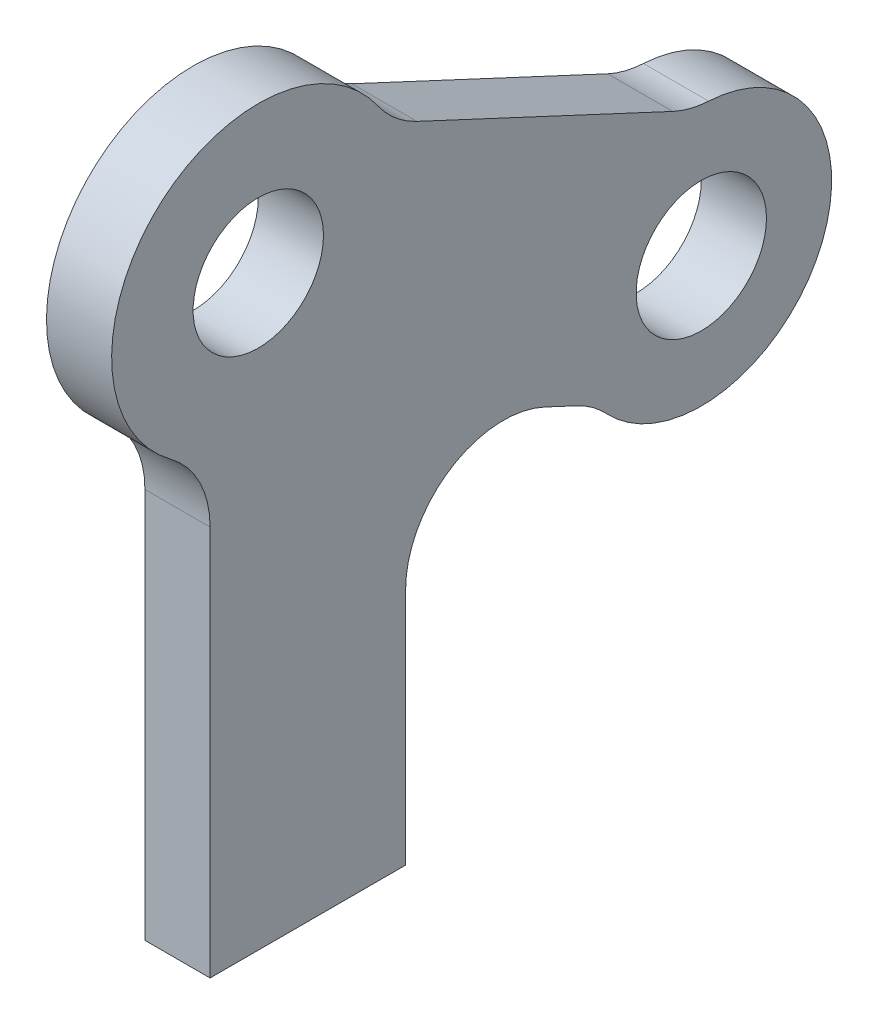
ISO-10303-21;
HEADER;
FILE_DESCRIPTION(('STEP AP214'),'2;1');
FILE_NAME('part.step','',(''),(''),'','','');
FILE_SCHEMA(('AUTOMOTIVE_DESIGN { 1 0 10303 214 1 1 1 1 }'));
ENDSEC;
DATA;
#1=APPLICATION_CONTEXT('core data for automotive mechanical design processes');
#2=APPLICATION_PROTOCOL_DEFINITION('international standard','automotive_design',2000,#1);
#3=PRODUCT_CONTEXT('',#1,'mechanical');
#4=PRODUCT('Part','Part','',(#3));
#5=PRODUCT_RELATED_PRODUCT_CATEGORY('part','',(#4));
#6=PRODUCT_DEFINITION_FORMATION('','',#4);
#7=PRODUCT_DEFINITION_CONTEXT('part definition',#1,'design');
#8=PRODUCT_DEFINITION('design','',#6,#7);
#9=PRODUCT_DEFINITION_SHAPE('','',#8);
#10=(LENGTH_UNIT() NAMED_UNIT(*) SI_UNIT(.MILLI.,.METRE.));
#11=(NAMED_UNIT(*) PLANE_ANGLE_UNIT() SI_UNIT($,.RADIAN.));
#12=(NAMED_UNIT(*) SI_UNIT($,.STERADIAN.) SOLID_ANGLE_UNIT());
#13=UNCERTAINTY_MEASURE_WITH_UNIT(LENGTH_MEASURE(1.E-05),#10,'distance_accuracy_value','');
#14=(GEOMETRIC_REPRESENTATION_CONTEXT(3) GLOBAL_UNCERTAINTY_ASSIGNED_CONTEXT((#13)) GLOBAL_UNIT_ASSIGNED_CONTEXT((#10,
#11,#12)) REPRESENTATION_CONTEXT('',''));
#15=CARTESIAN_POINT('',(0.,0.,0.));
#16=DIRECTION('',(0.,0.,1.));
#17=DIRECTION('',(1.,0.,0.));
#18=AXIS2_PLACEMENT_3D('',#15,#16,#17);
#19=CARTESIAN_POINT('',(0.,0.,0.));
#20=DIRECTION('',(1.,0.,0.));
#21=DIRECTION('',(0.,0.,-1.));
#22=AXIS2_PLACEMENT_3D('',#19,#20,#21);
#23=PLANE('',#22);
#24=CARTESIAN_POINT('',(0.,0.,0.));
#25=DIRECTION('',(1.,0.,0.));
#26=DIRECTION('',(0.,0.,-1.));
#27=AXIS2_PLACEMENT_3D('',#24,#25,#26);
#28=CIRCLE('',#27,2.);
#29=CARTESIAN_POINT('',(0.,0.,-2.));
#30=VERTEX_POINT('',#29);
#31=EDGE_CURVE('E381',#30,#30,#28,.T.);
#32=ORIENTED_EDGE('',*,*,#31,.T.);
#33=EDGE_LOOP('',(#32));
#34=FACE_BOUND('',#33,.T.);
#35=CARTESIAN_POINT('',(0.,-6.33927392611045,-13.5946168055498));
#36=DIRECTION('',(1.,0.,0.));
#37=DIRECTION('',(0.,0.,-1.));
#38=AXIS2_PLACEMENT_3D('',#35,#36,#37);
#39=CIRCLE('',#38,2.);
#40=CARTESIAN_POINT('',(0.,-6.33927392611045,-15.5946168055498));
#41=VERTEX_POINT('',#40);
#42=EDGE_CURVE('E402',#41,#41,#39,.T.);
#43=ORIENTED_EDGE('',*,*,#42,.T.);
#44=EDGE_LOOP('',(#43));
#45=FACE_BOUND('',#44,.T.);
#46=DIRECTION('',(0.,-1.,0.));
#47=VECTOR('',#46,1.);
#48=CARTESIAN_POINT('',(0.,-3.17207725462828,1.47916391609244));
#49=LINE('',#48,#47);
#50=CARTESIAN_POINT('',(0.,-6.01557068055687,1.47916391609244));
#51=VERTEX_POINT('',#50);
#52=CARTESIAN_POINT('',(0.,-18.,1.47916391609244));
#53=VERTEX_POINT('',#52);
#54=EDGE_CURVE('E219',#51,#53,#49,.T.);
#55=ORIENTED_EDGE('',*,*,#54,.F.);
#56=CARTESIAN_POINT('',(0.,-6.01557068055687,4.47916391609244));
#57=DIRECTION('',(1.,0.,0.));
#58=DIRECTION('',(0.,0.,-1.));
#59=AXIS2_PLACEMENT_3D('',#56,#57,#58);
#60=CIRCLE('',#59,3.);
#61=CARTESIAN_POINT('',(0.,-3.60934240833412,2.68749834965546));
#62=VERTEX_POINT('',#61);
#63=EDGE_CURVE('E117',#51,#62,#60,.T.);
#64=ORIENTED_EDGE('',*,*,#63,.T.);
#65=CARTESIAN_POINT('',(0.,0.,0.));
#66=DIRECTION('',(1.,0.,0.));
#67=DIRECTION('',(0.,0.,-1.));
#68=AXIS2_PLACEMENT_3D('',#65,#66,#67);
#69=CIRCLE('',#68,4.5);
#70=CARTESIAN_POINT('',(0.,2.58582472494635,-3.68286715642258));
#71=VERTEX_POINT('',#70);
#72=EDGE_CURVE('E294',#71,#62,#69,.T.);
#73=ORIENTED_EDGE('',*,*,#72,.F.);
#74=CARTESIAN_POINT('',(0.,4.30970787491059,-6.13811192737096));
#75=DIRECTION('',(1.,0.,0.));
#76=DIRECTION('',(0.,0.,-1.));
#77=AXIS2_PLACEMENT_3D('',#74,#75,#76);
#78=CIRCLE('',#77,3.);
#79=CARTESIAN_POINT('',(0.,1.59078451380063,-4.87025714214887));
#80=VERTEX_POINT('',#79);
#81=EDGE_CURVE('E282',#71,#80,#78,.T.);
#82=ORIENTED_EDGE('',*,*,#81,.T.);
#83=DIRECTION('',(0.,-0.422618261740697,-0.906307787036651));
#84=VECTOR('',#83,1.);
#85=CARTESIAN_POINT('',(0.,3.17207725462828,-1.47916391609244));
#86=LINE('',#85,#84);
#87=CARTESIAN_POINT('',(0.,-2.06920221917018,-12.719124019978));
#88=VERTEX_POINT('',#87);
#89=EDGE_CURVE('E357',#80,#88,#86,.T.);
#90=ORIENTED_EDGE('',*,*,#89,.T.);
#91=CARTESIAN_POINT('',(0.,0.649721141939774,-13.9869788052001));
#92=DIRECTION('',(1.,0.,0.));
#93=DIRECTION('',(0.,0.,-1.));
#94=AXIS2_PLACEMENT_3D('',#91,#92,#93);
#95=CIRCLE('',#94,3.);
#96=CARTESIAN_POINT('',(0.,-2.34556245865318,-13.8188236624928));
#97=VERTEX_POINT('',#96);
#98=EDGE_CURVE('E273',#88,#97,#95,.T.);
#99=ORIENTED_EDGE('',*,*,#98,.T.);
#100=CARTESIAN_POINT('',(0.,-6.33927392611045,-13.5946168055498));
#101=DIRECTION('',(1.,0.,0.));
#102=DIRECTION('',(0.,0.,-1.));
#103=AXIS2_PLACEMENT_3D('',#100,#101,#102);
#104=CIRCLE('',#103,4.);
#105=CARTESIAN_POINT('',(0.,-9.07813459092545,-10.6793737181334));
#106=VERTEX_POINT('',#105);
#107=EDGE_CURVE('E222',#106,#97,#104,.T.);
#108=ORIENTED_EDGE('',*,*,#107,.F.);
#109=CARTESIAN_POINT('',(0.,-11.1322800895367,-8.49294140257105));
#110=DIRECTION('',(1.,0.,0.));
#111=DIRECTION('',(0.,0.,-1.));
#112=AXIS2_PLACEMENT_3D('',#109,#110,#111);
#113=CIRCLE('',#112,3.);
#114=CARTESIAN_POINT('',(0.,-8.41335672842674,-9.76079618779314));
#115=VERTEX_POINT('',#114);
#116=EDGE_CURVE('E267',#106,#115,#113,.T.);
#117=ORIENTED_EDGE('',*,*,#116,.T.);
#118=DIRECTION('',(0.,-0.422618261740697,-0.906307787036651));
#119=VECTOR('',#118,1.);
#120=CARTESIAN_POINT('',(0.,-3.17207725462828,1.47916391609244));
#121=LINE('',#120,#119);
#122=CARTESIAN_POINT('',(0.,-7.96005657380075,-8.78869086912966));
#123=VERTEX_POINT('',#122);
#124=EDGE_CURVE('E362',#123,#115,#121,.T.);
#125=ORIENTED_EDGE('',*,*,#124,.F.);
#126=CARTESIAN_POINT('',(0.,-10.6789799349107,-7.52083608390756));
#127=DIRECTION('',(1.,0.,0.));
#128=DIRECTION('',(0.,0.,-1.));
#129=AXIS2_PLACEMENT_3D('',#126,#127,#128);
#130=CIRCLE('',#129,3.);
#131=CARTESIAN_POINT('',(0.,-10.6789799349107,-4.52083608390756));
#132=VERTEX_POINT('',#131);
#133=EDGE_CURVE('E285',#123,#132,#130,.T.);
#134=ORIENTED_EDGE('',*,*,#133,.T.);
#135=DIRECTION('',(0.,-1.,0.));
#136=VECTOR('',#135,1.);
#137=CARTESIAN_POINT('',(0.,-3.17207725462828,-4.52083608390756));
#138=LINE('',#137,#136);
#139=CARTESIAN_POINT('',(0.,-18.,-4.52083608390756));
#140=VERTEX_POINT('',#139);
#141=EDGE_CURVE('E205',#132,#140,#138,.T.);
#142=ORIENTED_EDGE('',*,*,#141,.T.);
#143=DIRECTION('',(0.,0.,-1.));
#144=VECTOR('',#143,1.);
#145=CARTESIAN_POINT('',(0.,-18.,1.47916391609244));
#146=LINE('',#145,#144);
#147=EDGE_CURVE('E380',#53,#140,#146,.T.);
#148=ORIENTED_EDGE('',*,*,#147,.F.);
#149=EDGE_LOOP('',(#55,#64,#73,#82,#90,#99,#108,#117,#125,#134,#142,#148));
#150=FACE_BOUND('',#149,.T.);
#151=ADVANCED_FACE('F108',(#34,#45,#150),#23,.F.);
#152=CARTESIAN_POINT('',(2.,0.,0.));
#153=DIRECTION('',(1.,0.,0.));
#154=DIRECTION('',(0.,0.,-1.));
#155=AXIS2_PLACEMENT_3D('',#152,#153,#154);
#156=PLANE('',#155);
#157=CARTESIAN_POINT('',(2.,0.,0.));
#158=DIRECTION('',(1.,0.,0.));
#159=DIRECTION('',(0.,0.,-1.));
#160=AXIS2_PLACEMENT_3D('',#157,#158,#159);
#161=CIRCLE('',#160,2.);
#162=CARTESIAN_POINT('',(2.,0.,-2.));
#163=VERTEX_POINT('',#162);
#164=EDGE_CURVE('E406',#163,#163,#161,.T.);
#165=ORIENTED_EDGE('',*,*,#164,.F.);
#166=EDGE_LOOP('',(#165));
#167=FACE_BOUND('',#166,.T.);
#168=CARTESIAN_POINT('',(2.,-6.33927392611045,-13.5946168055498));
#169=DIRECTION('',(1.,0.,0.));
#170=DIRECTION('',(0.,0.,-1.));
#171=AXIS2_PLACEMENT_3D('',#168,#169,#170);
#172=CIRCLE('',#171,2.);
#173=CARTESIAN_POINT('',(2.,-6.33927392611045,-15.5946168055498));
#174=VERTEX_POINT('',#173);
#175=EDGE_CURVE('E407',#174,#174,#172,.T.);
#176=ORIENTED_EDGE('',*,*,#175,.F.);
#177=EDGE_LOOP('',(#176));
#178=FACE_BOUND('',#177,.T.);
#179=DIRECTION('',(0.,-0.422618261740697,-0.906307787036651));
#180=VECTOR('',#179,1.);
#181=CARTESIAN_POINT('',(2.,3.17207725462828,-1.47916391609244));
#182=LINE('',#181,#180);
#183=CARTESIAN_POINT('',(2.,1.59078451380063,-4.87025714214887));
#184=VERTEX_POINT('',#183);
#185=CARTESIAN_POINT('',(2.,-2.06920221917018,-12.719124019978));
#186=VERTEX_POINT('',#185);
#187=EDGE_CURVE('E236',#184,#186,#182,.T.);
#188=ORIENTED_EDGE('',*,*,#187,.F.);
#189=CARTESIAN_POINT('',(2.,4.30970787491059,-6.13811192737096));
#190=DIRECTION('',(1.,0.,0.));
#191=DIRECTION('',(0.,0.,-1.));
#192=AXIS2_PLACEMENT_3D('',#189,#190,#191);
#193=CIRCLE('',#192,3.);
#194=CARTESIAN_POINT('',(2.,2.58582472494635,-3.68286715642258));
#195=VERTEX_POINT('',#194);
#196=EDGE_CURVE('E279',#184,#195,#193,.F.);
#197=ORIENTED_EDGE('',*,*,#196,.T.);
#198=CARTESIAN_POINT('',(2.,0.,0.));
#199=DIRECTION('',(1.,0.,0.));
#200=DIRECTION('',(0.,0.,-1.));
#201=AXIS2_PLACEMENT_3D('',#198,#199,#200);
#202=CIRCLE('',#201,4.5);
#203=CARTESIAN_POINT('',(2.,-3.60934240833412,2.68749834965546));
#204=VERTEX_POINT('',#203);
#205=EDGE_CURVE('E301',#195,#204,#202,.T.);
#206=ORIENTED_EDGE('',*,*,#205,.T.);
#207=CARTESIAN_POINT('',(2.,-6.01557068055687,4.47916391609244));
#208=DIRECTION('',(1.,0.,0.));
#209=DIRECTION('',(0.,0.,-1.));
#210=AXIS2_PLACEMENT_3D('',#207,#208,#209);
#211=CIRCLE('',#210,3.);
#212=CARTESIAN_POINT('',(2.,-6.01557068055687,1.47916391609244));
#213=VERTEX_POINT('',#212);
#214=EDGE_CURVE('E12',#204,#213,#211,.F.);
#215=ORIENTED_EDGE('',*,*,#214,.T.);
#216=DIRECTION('',(0.,-1.,0.));
#217=VECTOR('',#216,1.);
#218=CARTESIAN_POINT('',(2.,-3.17207725462828,1.47916391609244));
#219=LINE('',#218,#217);
#220=CARTESIAN_POINT('',(2.,-18.,1.47916391609244));
#221=VERTEX_POINT('',#220);
#222=EDGE_CURVE('E195',#213,#221,#219,.T.);
#223=ORIENTED_EDGE('',*,*,#222,.T.);
#224=DIRECTION('',(0.,0.,-1.));
#225=VECTOR('',#224,1.);
#226=CARTESIAN_POINT('',(2.,-18.,1.47916391609244));
#227=LINE('',#226,#225);
#228=CARTESIAN_POINT('',(2.,-18.,-4.52083608390756));
#229=VERTEX_POINT('',#228);
#230=EDGE_CURVE('E200',#221,#229,#227,.T.);
#231=ORIENTED_EDGE('',*,*,#230,.T.);
#232=DIRECTION('',(0.,-1.,0.));
#233=VECTOR('',#232,1.);
#234=CARTESIAN_POINT('',(2.,-3.17207725462828,-4.52083608390756));
#235=LINE('',#234,#233);
#236=CARTESIAN_POINT('',(2.,-10.6789799349107,-4.52083608390756));
#237=VERTEX_POINT('',#236);
#238=EDGE_CURVE('E215',#237,#229,#235,.T.);
#239=ORIENTED_EDGE('',*,*,#238,.F.);
#240=CARTESIAN_POINT('',(2.,-10.6789799349107,-7.52083608390756));
#241=DIRECTION('',(1.,0.,0.));
#242=DIRECTION('',(0.,0.,-1.));
#243=AXIS2_PLACEMENT_3D('',#240,#241,#242);
#244=CIRCLE('',#243,3.);
#245=CARTESIAN_POINT('',(2.,-7.96005657380075,-8.78869086912966));
#246=VERTEX_POINT('',#245);
#247=EDGE_CURVE('E288',#237,#246,#244,.F.);
#248=ORIENTED_EDGE('',*,*,#247,.T.);
#249=DIRECTION('',(0.,-0.422618261740697,-0.906307787036651));
#250=VECTOR('',#249,1.);
#251=CARTESIAN_POINT('',(2.,-3.17207725462828,1.47916391609244));
#252=LINE('',#251,#250);
#253=CARTESIAN_POINT('',(2.,-8.41335672842674,-9.76079618779314));
#254=VERTEX_POINT('',#253);
#255=EDGE_CURVE('E361',#246,#254,#252,.T.);
#256=ORIENTED_EDGE('',*,*,#255,.T.);
#257=CARTESIAN_POINT('',(2.,-11.1322800895367,-8.49294140257105));
#258=DIRECTION('',(1.,0.,0.));
#259=DIRECTION('',(0.,0.,-1.));
#260=AXIS2_PLACEMENT_3D('',#257,#258,#259);
#261=CIRCLE('',#260,3.);
#262=CARTESIAN_POINT('',(2.,-9.07813459092545,-10.6793737181334));
#263=VERTEX_POINT('',#262);
#264=EDGE_CURVE('E270',#254,#263,#261,.F.);
#265=ORIENTED_EDGE('',*,*,#264,.T.);
#266=CARTESIAN_POINT('',(2.,-6.33927392611045,-13.5946168055498));
#267=DIRECTION('',(1.,0.,0.));
#268=DIRECTION('',(0.,0.,-1.));
#269=AXIS2_PLACEMENT_3D('',#266,#267,#268);
#270=CIRCLE('',#269,4.);
#271=CARTESIAN_POINT('',(2.,-2.34556245865318,-13.8188236624928));
#272=VERTEX_POINT('',#271);
#273=EDGE_CURVE('E227',#263,#272,#270,.T.);
#274=ORIENTED_EDGE('',*,*,#273,.T.);
#275=CARTESIAN_POINT('',(2.,0.649721141939774,-13.9869788052001));
#276=DIRECTION('',(1.,0.,0.));
#277=DIRECTION('',(0.,0.,-1.));
#278=AXIS2_PLACEMENT_3D('',#275,#276,#277);
#279=CIRCLE('',#278,3.);
#280=EDGE_CURVE('E276',#272,#186,#279,.F.);
#281=ORIENTED_EDGE('',*,*,#280,.T.);
#282=EDGE_LOOP('',(#188,#197,#206,#215,#223,#231,#239,#248,#256,#265,#274,#281));
#283=FACE_BOUND('',#282,.T.);
#284=ADVANCED_FACE('F198',(#167,#178,#283),#156,.T.);
#285=CARTESIAN_POINT('',(2.,-3.17207725462828,1.47916391609244));
#286=DIRECTION('',(0.,0.906307787036651,-0.422618261740697));
#287=DIRECTION('',(0.,0.422618261740697,0.906307787036651));
#288=AXIS2_PLACEMENT_3D('',#285,#286,#287);
#289=PLANE('',#288);
#290=ORIENTED_EDGE('',*,*,#124,.T.);
#291=DIRECTION('',(1.,0.,0.));
#292=VECTOR('',#291,1.);
#293=CARTESIAN_POINT('',(2.,-8.41335672842674,-9.76079618779314));
#294=LINE('',#293,#292);
#295=EDGE_CURVE('E244',#115,#254,#294,.T.);
#296=ORIENTED_EDGE('',*,*,#295,.T.);
#297=ORIENTED_EDGE('',*,*,#255,.F.);
#298=DIRECTION('',(-1.,0.,0.));
#299=VECTOR('',#298,1.);
#300=CARTESIAN_POINT('',(2.,-7.96005657380075,-8.78869086912965));
#301=LINE('',#300,#299);
#302=EDGE_CURVE('E240',#246,#123,#301,.T.);
#303=ORIENTED_EDGE('',*,*,#302,.T.);
#304=EDGE_LOOP('',(#290,#296,#297,#303));
#305=FACE_BOUND('',#304,.T.);
#306=ADVANCED_FACE('F310',(#305),#289,.F.);
#307=CARTESIAN_POINT('',(2.,3.17207725462828,-1.47916391609244));
#308=DIRECTION('',(0.,0.906307787036651,-0.422618261740697));
#309=DIRECTION('',(0.,0.422618261740697,0.906307787036651));
#310=AXIS2_PLACEMENT_3D('',#307,#308,#309);
#311=PLANE('',#310);
#312=ORIENTED_EDGE('',*,*,#187,.T.);
#313=DIRECTION('',(-1.,0.,0.));
#314=VECTOR('',#313,1.);
#315=CARTESIAN_POINT('',(2.,-2.06920221917018,-12.719124019978));
#316=LINE('',#315,#314);
#317=EDGE_CURVE('E251',#186,#88,#316,.T.);
#318=ORIENTED_EDGE('',*,*,#317,.T.);
#319=ORIENTED_EDGE('',*,*,#89,.F.);
#320=DIRECTION('',(-1.,0.,0.));
#321=VECTOR('',#320,1.);
#322=CARTESIAN_POINT('',(2.,1.59078451380063,-4.87025714214887));
#323=LINE('',#322,#321);
#324=EDGE_CURVE('E247',#80,#184,#323,.F.);
#325=ORIENTED_EDGE('',*,*,#324,.T.);
#326=EDGE_LOOP('',(#312,#318,#319,#325));
#327=FACE_BOUND('',#326,.T.);
#328=ADVANCED_FACE('F312',(#327),#311,.T.);
#329=CARTESIAN_POINT('',(2.,0.,0.));
#330=DIRECTION('',(-1.,0.,0.));
#331=DIRECTION('',(0.,0.,1.));
#332=AXIS2_PLACEMENT_3D('',#329,#330,#331);
#333=CYLINDRICAL_SURFACE('',#332,4.5);
#334=ORIENTED_EDGE('',*,*,#205,.F.);
#335=DIRECTION('',(-1.,0.,0.));
#336=VECTOR('',#335,1.);
#337=CARTESIAN_POINT('',(2.,2.58582472494635,-3.68286715642258));
#338=LINE('',#337,#336);
#339=EDGE_CURVE('E258',#195,#71,#338,.T.);
#340=ORIENTED_EDGE('',*,*,#339,.T.);
#341=ORIENTED_EDGE('',*,*,#72,.T.);
#342=DIRECTION('',(-1.,0.,0.));
#343=VECTOR('',#342,1.);
#344=CARTESIAN_POINT('',(2.,-3.60934240833412,2.68749834965546));
#345=LINE('',#344,#343);
#346=EDGE_CURVE('E255',#62,#204,#345,.F.);
#347=ORIENTED_EDGE('',*,*,#346,.T.);
#348=EDGE_LOOP('',(#334,#340,#341,#347));
#349=FACE_BOUND('',#348,.T.);
#350=ADVANCED_FACE('F298',(#349),#333,.T.);
#351=CARTESIAN_POINT('',(2.,-3.17207725462828,1.47916391609244));
#352=DIRECTION('',(0.,0.,-1.));
#353=DIRECTION('',(0.,1.,0.));
#354=AXIS2_PLACEMENT_3D('',#351,#352,#353);
#355=PLANE('',#354);
#356=ORIENTED_EDGE('',*,*,#222,.F.);
#357=DIRECTION('',(1.,0.,0.));
#358=VECTOR('',#357,1.);
#359=CARTESIAN_POINT('',(0.,-6.01557068055687,1.47916391609244));
#360=LINE('',#359,#358);
#361=EDGE_CURVE('E264',#213,#51,#360,.F.);
#362=ORIENTED_EDGE('',*,*,#361,.T.);
#363=ORIENTED_EDGE('',*,*,#54,.T.);
#364=DIRECTION('',(-1.,0.,0.));
#365=VECTOR('',#364,1.);
#366=CARTESIAN_POINT('',(2.,-18.,1.47916391609244));
#367=LINE('',#366,#365);
#368=EDGE_CURVE('E211',#221,#53,#367,.T.);
#369=ORIENTED_EDGE('',*,*,#368,.F.);
#370=EDGE_LOOP('',(#356,#362,#363,#369));
#371=FACE_BOUND('',#370,.T.);
#372=ADVANCED_FACE('F217',(#371),#355,.F.);
#373=CARTESIAN_POINT('',(2.,-18.,1.47916391609244));
#374=DIRECTION('',(0.,1.,0.));
#375=DIRECTION('',(0.,0.,1.));
#376=AXIS2_PLACEMENT_3D('',#373,#374,#375);
#377=PLANE('',#376);
#378=ORIENTED_EDGE('',*,*,#147,.T.);
#379=DIRECTION('',(-1.,0.,0.));
#380=VECTOR('',#379,1.);
#381=CARTESIAN_POINT('',(2.,-18.,-4.52083608390756));
#382=LINE('',#381,#380);
#383=EDGE_CURVE('E213',#229,#140,#382,.T.);
#384=ORIENTED_EDGE('',*,*,#383,.F.);
#385=ORIENTED_EDGE('',*,*,#230,.F.);
#386=ORIENTED_EDGE('',*,*,#368,.T.);
#387=EDGE_LOOP('',(#378,#384,#385,#386));
#388=FACE_BOUND('',#387,.T.);
#389=ADVANCED_FACE('F210',(#388),#377,.F.);
#390=CARTESIAN_POINT('',(2.,-3.17207725462828,-4.52083608390756));
#391=DIRECTION('',(0.,0.,-1.));
#392=DIRECTION('',(0.,1.,0.));
#393=AXIS2_PLACEMENT_3D('',#390,#391,#392);
#394=PLANE('',#393);
#395=ORIENTED_EDGE('',*,*,#141,.F.);
#396=DIRECTION('',(-1.,0.,0.));
#397=VECTOR('',#396,1.);
#398=CARTESIAN_POINT('',(2.,-10.6789799349107,-4.52083608390756));
#399=LINE('',#398,#397);
#400=EDGE_CURVE('E261',#132,#237,#399,.F.);
#401=ORIENTED_EDGE('',*,*,#400,.T.);
#402=ORIENTED_EDGE('',*,*,#238,.T.);
#403=ORIENTED_EDGE('',*,*,#383,.T.);
#404=EDGE_LOOP('',(#395,#401,#402,#403));
#405=FACE_BOUND('',#404,.T.);
#406=ADVANCED_FACE('F325',(#405),#394,.T.);
#407=CARTESIAN_POINT('',(2.,-6.33927392611045,-13.5946168055498));
#408=DIRECTION('',(-1.,0.,0.));
#409=DIRECTION('',(0.,0.,1.));
#410=AXIS2_PLACEMENT_3D('',#407,#408,#409);
#411=CYLINDRICAL_SURFACE('',#410,4.);
#412=ORIENTED_EDGE('',*,*,#273,.F.);
#413=DIRECTION('',(-1.,0.,0.));
#414=VECTOR('',#413,1.);
#415=CARTESIAN_POINT('',(2.,-9.07813459092545,-10.6793737181334));
#416=LINE('',#415,#414);
#417=EDGE_CURVE('E235',#263,#106,#416,.T.);
#418=ORIENTED_EDGE('',*,*,#417,.T.);
#419=ORIENTED_EDGE('',*,*,#107,.T.);
#420=DIRECTION('',(-1.,0.,0.));
#421=VECTOR('',#420,1.);
#422=CARTESIAN_POINT('',(2.,-2.34556245865318,-13.8188236624928));
#423=LINE('',#422,#421);
#424=EDGE_CURVE('E232',#97,#272,#423,.F.);
#425=ORIENTED_EDGE('',*,*,#424,.T.);
#426=EDGE_LOOP('',(#412,#418,#419,#425));
#427=FACE_BOUND('',#426,.T.);
#428=ADVANCED_FACE('F321',(#427),#411,.T.);
#429=CARTESIAN_POINT('',(-1.2E-05,-6.33927392611045,-13.5946168055498));
#430=DIRECTION('',(1.,0.,0.));
#431=DIRECTION('',(0.,0.,-1.));
#432=AXIS2_PLACEMENT_3D('',#429,#430,#431);
#433=CYLINDRICAL_SURFACE('',#432,2.);
#434=CARTESIAN_POINT('',(2.,-6.33927392611045,-15.5946168055498));
#435=CARTESIAN_POINT('',(1.97916666666667,-6.33927392611045,-15.5946168055498));
#436=CARTESIAN_POINT('',(1.95833333333333,-6.33927392611045,-15.5946168055498));
#437=CARTESIAN_POINT('',(1.91666666666667,-6.33927392611045,-15.5946168055498));
#438=CARTESIAN_POINT('',(1.89583333333333,-6.33927392611045,-15.5946168055498));
#439=CARTESIAN_POINT('',(1.85416666666667,-6.33927392611045,-15.5946168055498));
#440=CARTESIAN_POINT('',(1.83333333333333,-6.33927392611045,-15.5946168055498));
#441=CARTESIAN_POINT('',(1.79166666666667,-6.33927392611045,-15.5946168055498));
#442=CARTESIAN_POINT('',(1.77083333333333,-6.33927392611045,-15.5946168055498));
#443=CARTESIAN_POINT('',(1.72916666666667,-6.33927392611045,-15.5946168055498));
#444=CARTESIAN_POINT('',(1.70833333333333,-6.33927392611045,-15.5946168055498));
#445=CARTESIAN_POINT('',(1.66666666666667,-6.33927392611045,-15.5946168055498));
#446=CARTESIAN_POINT('',(1.64583333333333,-6.33927392611045,-15.5946168055498));
#447=CARTESIAN_POINT('',(1.60416666666667,-6.33927392611045,-15.5946168055498));
#448=CARTESIAN_POINT('',(1.58333333333333,-6.33927392611045,-15.5946168055498));
#449=CARTESIAN_POINT('',(1.54166666666667,-6.33927392611045,-15.5946168055498));
#450=CARTESIAN_POINT('',(1.52083333333333,-6.33927392611045,-15.5946168055498));
#451=CARTESIAN_POINT('',(1.47916666666667,-6.33927392611045,-15.5946168055498));
#452=CARTESIAN_POINT('',(1.45833333333333,-6.33927392611045,-15.5946168055498));
#453=CARTESIAN_POINT('',(1.41666666666667,-6.33927392611045,-15.5946168055498));
#454=CARTESIAN_POINT('',(1.39583333333333,-6.33927392611045,-15.5946168055498));
#455=CARTESIAN_POINT('',(1.35416666666667,-6.33927392611045,-15.5946168055498));
#456=CARTESIAN_POINT('',(1.33333333333333,-6.33927392611045,-15.5946168055498));
#457=CARTESIAN_POINT('',(1.29166666666667,-6.33927392611045,-15.5946168055498));
#458=CARTESIAN_POINT('',(1.27083333333333,-6.33927392611045,-15.5946168055498));
#459=CARTESIAN_POINT('',(1.22916666666667,-6.33927392611045,-15.5946168055498));
#460=CARTESIAN_POINT('',(1.20833333333333,-6.33927392611045,-15.5946168055498));
#461=CARTESIAN_POINT('',(1.16666666666667,-6.33927392611045,-15.5946168055498));
#462=CARTESIAN_POINT('',(1.14583333333333,-6.33927392611045,-15.5946168055498));
#463=CARTESIAN_POINT('',(1.10416666666667,-6.33927392611045,-15.5946168055498));
#464=CARTESIAN_POINT('',(1.08333333333333,-6.33927392611045,-15.5946168055498));
#465=CARTESIAN_POINT('',(1.04166666666667,-6.33927392611045,-15.5946168055498));
#466=CARTESIAN_POINT('',(1.02083333333333,-6.33927392611045,-15.5946168055498));
#467=CARTESIAN_POINT('',(0.979166666666667,-6.33927392611045,-15.5946168055498));
#468=CARTESIAN_POINT('',(0.958333333333334,-6.33927392611045,-15.5946168055498));
#469=CARTESIAN_POINT('',(0.916666666666667,-6.33927392611045,-15.5946168055498));
#470=CARTESIAN_POINT('',(0.895833333333334,-6.33927392611045,-15.5946168055498));
#471=CARTESIAN_POINT('',(0.854166666666667,-6.33927392611045,-15.5946168055498));
#472=CARTESIAN_POINT('',(0.833333333333334,-6.33927392611045,-15.5946168055498));
#473=CARTESIAN_POINT('',(0.791666666666667,-6.33927392611045,-15.5946168055498));
#474=CARTESIAN_POINT('',(0.770833333333334,-6.33927392611045,-15.5946168055498));
#475=CARTESIAN_POINT('',(0.729166666666667,-6.33927392611045,-15.5946168055498));
#476=CARTESIAN_POINT('',(0.708333333333334,-6.33927392611045,-15.5946168055498));
#477=CARTESIAN_POINT('',(0.666666666666667,-6.33927392611045,-15.5946168055498));
#478=CARTESIAN_POINT('',(0.645833333333334,-6.33927392611045,-15.5946168055498));
#479=CARTESIAN_POINT('',(0.604166666666667,-6.33927392611045,-15.5946168055498));
#480=CARTESIAN_POINT('',(0.583333333333333,-6.33927392611045,-15.5946168055498));
#481=CARTESIAN_POINT('',(0.541666666666667,-6.33927392611045,-15.5946168055498));
#482=CARTESIAN_POINT('',(0.520833333333333,-6.33927392611045,-15.5946168055498));
#483=CARTESIAN_POINT('',(0.479166666666667,-6.33927392611045,-15.5946168055498));
#484=CARTESIAN_POINT('',(0.458333333333334,-6.33927392611045,-15.5946168055498));
#485=CARTESIAN_POINT('',(0.416666666666667,-6.33927392611045,-15.5946168055498));
#486=CARTESIAN_POINT('',(0.395833333333334,-6.33927392611045,-15.5946168055498));
#487=CARTESIAN_POINT('',(0.354166666666667,-6.33927392611045,-15.5946168055498));
#488=CARTESIAN_POINT('',(0.333333333333334,-6.33927392611045,-15.5946168055498));
#489=CARTESIAN_POINT('',(0.291666666666667,-6.33927392611045,-15.5946168055498));
#490=CARTESIAN_POINT('',(0.270833333333333,-6.33927392611045,-15.5946168055498));
#491=CARTESIAN_POINT('',(0.229166666666667,-6.33927392611045,-15.5946168055498));
#492=CARTESIAN_POINT('',(0.208333333333333,-6.33927392611045,-15.5946168055498));
#493=CARTESIAN_POINT('',(0.166666666666667,-6.33927392611045,-15.5946168055498));
#494=CARTESIAN_POINT('',(0.145833333333334,-6.33927392611045,-15.5946168055498));
#495=CARTESIAN_POINT('',(0.104166666666667,-6.33927392611045,-15.5946168055498));
#496=CARTESIAN_POINT('',(0.0833333333333336,-6.33927392611045,-15.5946168055498));
#497=CARTESIAN_POINT('',(0.0416666666666669,-6.33927392611045,-15.5946168055498));
#498=CARTESIAN_POINT('',(0.0208333333333335,-6.33927392611045,-15.5946168055498));
#499=CARTESIAN_POINT('',(0.,-6.33927392611045,-15.5946168055498));
#500=B_SPLINE_CURVE_WITH_KNOTS('',3,(#434,#435,#436,#437,#438,#439,#440,#441,#442,#443,#444,
#445,#446,#447,#448,#449,#450,#451,#452,#453,#454,#455,#456,#457,#458,#459,#460,#461,#462,#463,
#464,#465,#466,#467,#468,#469,#470,#471,#472,#473,#474,#475,#476,#477,#478,#479,#480,#481,#482,
#483,#484,#485,#486,#487,#488,#489,#490,#491,#492,#493,#494,#495,#496,#497,#498,#499),
.UNSPECIFIED.,.F.,.F.,(4,2,2,2,2,2,2,2,2,2,2,2,2,2,2,2,2,2,2,2,2,2,2,2,2,2,2,2,2,2,2,2,4),(0.,
0.0624999999999996,0.125,0.1875,0.25,0.3125,0.375,0.4375,0.5,0.5625,0.625,0.6875,0.75,0.8125,
0.875,0.9375,1.,1.0625,1.125,1.1875,1.25,1.3125,1.375,1.4375,1.5,1.5625,1.625,1.6875,1.75,
1.8125,1.875,1.9375,2.),.UNSPECIFIED.);
#501=EDGE_CURVE('BSEAM324',#174,#41,#500,.T.);
#502=ORIENTED_EDGE('',*,*,#175,.T.);
#503=ORIENTED_EDGE('',*,*,#42,.F.);
#504=ORIENTED_EDGE('',*,*,#501,.T.);
#505=ORIENTED_EDGE('',*,*,#501,.F.);
#506=EDGE_LOOP('',(#502,#504,#503,#505));
#507=FACE_BOUND('',#506,.T.);
#508=ADVANCED_FACE('F324',(#507),#433,.F.);
#509=CARTESIAN_POINT('',(-1.2E-05,0.,0.));
#510=DIRECTION('',(1.,0.,0.));
#511=DIRECTION('',(0.,0.,-1.));
#512=AXIS2_PLACEMENT_3D('',#509,#510,#511);
#513=CYLINDRICAL_SURFACE('',#512,2.);
#514=CARTESIAN_POINT('',(2.,0.,-2.));
#515=CARTESIAN_POINT('',(1.97916666666667,0.,-2.));
#516=CARTESIAN_POINT('',(1.95833333333333,0.,-2.));
#517=CARTESIAN_POINT('',(1.91666666666667,0.,-2.));
#518=CARTESIAN_POINT('',(1.89583333333333,0.,-2.));
#519=CARTESIAN_POINT('',(1.85416666666667,0.,-2.));
#520=CARTESIAN_POINT('',(1.83333333333333,0.,-2.));
#521=CARTESIAN_POINT('',(1.79166666666667,0.,-2.));
#522=CARTESIAN_POINT('',(1.77083333333333,0.,-2.));
#523=CARTESIAN_POINT('',(1.72916666666667,0.,-2.));
#524=CARTESIAN_POINT('',(1.70833333333333,0.,-2.));
#525=CARTESIAN_POINT('',(1.66666666666667,0.,-2.));
#526=CARTESIAN_POINT('',(1.64583333333333,0.,-2.));
#527=CARTESIAN_POINT('',(1.60416666666667,0.,-2.));
#528=CARTESIAN_POINT('',(1.58333333333333,0.,-2.));
#529=CARTESIAN_POINT('',(1.54166666666667,0.,-2.));
#530=CARTESIAN_POINT('',(1.52083333333333,0.,-2.));
#531=CARTESIAN_POINT('',(1.47916666666667,0.,-2.));
#532=CARTESIAN_POINT('',(1.45833333333333,0.,-2.));
#533=CARTESIAN_POINT('',(1.41666666666667,0.,-2.));
#534=CARTESIAN_POINT('',(1.39583333333333,0.,-2.));
#535=CARTESIAN_POINT('',(1.35416666666667,0.,-2.));
#536=CARTESIAN_POINT('',(1.33333333333333,0.,-2.));
#537=CARTESIAN_POINT('',(1.29166666666667,0.,-2.));
#538=CARTESIAN_POINT('',(1.27083333333333,0.,-2.));
#539=CARTESIAN_POINT('',(1.22916666666667,0.,-2.));
#540=CARTESIAN_POINT('',(1.20833333333333,0.,-2.));
#541=CARTESIAN_POINT('',(1.16666666666667,0.,-2.));
#542=CARTESIAN_POINT('',(1.14583333333333,0.,-2.));
#543=CARTESIAN_POINT('',(1.10416666666667,0.,-2.));
#544=CARTESIAN_POINT('',(1.08333333333333,0.,-2.));
#545=CARTESIAN_POINT('',(1.04166666666667,0.,-2.));
#546=CARTESIAN_POINT('',(1.02083333333333,0.,-2.));
#547=CARTESIAN_POINT('',(0.979166666666667,0.,-2.));
#548=CARTESIAN_POINT('',(0.958333333333334,0.,-2.));
#549=CARTESIAN_POINT('',(0.916666666666667,0.,-2.));
#550=CARTESIAN_POINT('',(0.895833333333334,0.,-2.));
#551=CARTESIAN_POINT('',(0.854166666666667,0.,-2.));
#552=CARTESIAN_POINT('',(0.833333333333334,0.,-2.));
#553=CARTESIAN_POINT('',(0.791666666666667,0.,-2.));
#554=CARTESIAN_POINT('',(0.770833333333334,0.,-2.));
#555=CARTESIAN_POINT('',(0.729166666666667,0.,-2.));
#556=CARTESIAN_POINT('',(0.708333333333334,0.,-2.));
#557=CARTESIAN_POINT('',(0.666666666666667,0.,-2.));
#558=CARTESIAN_POINT('',(0.645833333333334,0.,-2.));
#559=CARTESIAN_POINT('',(0.604166666666667,0.,-2.));
#560=CARTESIAN_POINT('',(0.583333333333333,0.,-2.));
#561=CARTESIAN_POINT('',(0.541666666666667,0.,-2.));
#562=CARTESIAN_POINT('',(0.520833333333333,0.,-2.));
#563=CARTESIAN_POINT('',(0.479166666666667,0.,-2.));
#564=CARTESIAN_POINT('',(0.458333333333334,0.,-2.));
#565=CARTESIAN_POINT('',(0.416666666666667,0.,-2.));
#566=CARTESIAN_POINT('',(0.395833333333334,0.,-2.));
#567=CARTESIAN_POINT('',(0.354166666666667,0.,-2.));
#568=CARTESIAN_POINT('',(0.333333333333334,0.,-2.));
#569=CARTESIAN_POINT('',(0.291666666666667,0.,-2.));
#570=CARTESIAN_POINT('',(0.270833333333333,0.,-2.));
#571=CARTESIAN_POINT('',(0.229166666666667,0.,-2.));
#572=CARTESIAN_POINT('',(0.208333333333333,0.,-2.));
#573=CARTESIAN_POINT('',(0.166666666666667,0.,-2.));
#574=CARTESIAN_POINT('',(0.145833333333334,0.,-2.));
#575=CARTESIAN_POINT('',(0.104166666666667,0.,-2.));
#576=CARTESIAN_POINT('',(0.0833333333333336,0.,-2.));
#577=CARTESIAN_POINT('',(0.0416666666666669,0.,-2.));
#578=CARTESIAN_POINT('',(0.0208333333333335,0.,-2.));
#579=CARTESIAN_POINT('',(0.,0.,-2.));
#580=B_SPLINE_CURVE_WITH_KNOTS('',3,(#514,#515,#516,#517,#518,#519,#520,#521,#522,#523,#524,
#525,#526,#527,#528,#529,#530,#531,#532,#533,#534,#535,#536,#537,#538,#539,#540,#541,#542,#543,
#544,#545,#546,#547,#548,#549,#550,#551,#552,#553,#554,#555,#556,#557,#558,#559,#560,#561,#562,
#563,#564,#565,#566,#567,#568,#569,#570,#571,#572,#573,#574,#575,#576,#577,#578,#579),
.UNSPECIFIED.,.F.,.F.,(4,2,2,2,2,2,2,2,2,2,2,2,2,2,2,2,2,2,2,2,2,2,2,2,2,2,2,2,2,2,2,2,4),(0.,
0.0624999999999996,0.125,0.1875,0.25,0.3125,0.375,0.4375,0.5,0.5625,0.625,0.6875,0.75,0.8125,
0.875,0.9375,1.,1.0625,1.125,1.1875,1.25,1.3125,1.375,1.4375,1.5,1.5625,1.625,1.6875,1.75,
1.8125,1.875,1.9375,2.),.UNSPECIFIED.);
#581=EDGE_CURVE('BSEAM345',#163,#30,#580,.T.);
#582=ORIENTED_EDGE('',*,*,#164,.T.);
#583=ORIENTED_EDGE('',*,*,#31,.F.);
#584=ORIENTED_EDGE('',*,*,#581,.T.);
#585=ORIENTED_EDGE('',*,*,#581,.F.);
#586=EDGE_LOOP('',(#582,#584,#583,#585));
#587=FACE_BOUND('',#586,.T.);
#588=ADVANCED_FACE('F345',(#587),#513,.F.);
#589=CARTESIAN_POINT('',(2.,-11.1322800895367,-8.49294140257105));
#590=DIRECTION('',(-1.,0.,0.));
#591=DIRECTION('',(0.,0.,1.));
#592=AXIS2_PLACEMENT_3D('',#589,#590,#591);
#593=CYLINDRICAL_SURFACE('',#592,3.);
#594=ORIENTED_EDGE('',*,*,#264,.F.);
#595=ORIENTED_EDGE('',*,*,#295,.F.);
#596=ORIENTED_EDGE('',*,*,#116,.F.);
#597=ORIENTED_EDGE('',*,*,#417,.F.);
#598=EDGE_LOOP('',(#594,#595,#596,#597));
#599=FACE_BOUND('',#598,.T.);
#600=ADVANCED_FACE('F341',(#599),#593,.F.);
#601=CARTESIAN_POINT('',(2.,0.649721141939774,-13.9869788052001));
#602=DIRECTION('',(-1.,0.,0.));
#603=DIRECTION('',(0.,0.,1.));
#604=AXIS2_PLACEMENT_3D('',#601,#602,#603);
#605=CYLINDRICAL_SURFACE('',#604,3.);
#606=ORIENTED_EDGE('',*,*,#280,.F.);
#607=ORIENTED_EDGE('',*,*,#424,.F.);
#608=ORIENTED_EDGE('',*,*,#98,.F.);
#609=ORIENTED_EDGE('',*,*,#317,.F.);
#610=EDGE_LOOP('',(#606,#607,#608,#609));
#611=FACE_BOUND('',#610,.T.);
#612=ADVANCED_FACE('F344',(#611),#605,.F.);
#613=CARTESIAN_POINT('',(2.,4.30970787491059,-6.13811192737096));
#614=DIRECTION('',(-1.,0.,0.));
#615=DIRECTION('',(0.,0.,1.));
#616=AXIS2_PLACEMENT_3D('',#613,#614,#615);
#617=CYLINDRICAL_SURFACE('',#616,3.);
#618=ORIENTED_EDGE('',*,*,#81,.F.);
#619=ORIENTED_EDGE('',*,*,#339,.F.);
#620=ORIENTED_EDGE('',*,*,#196,.F.);
#621=ORIENTED_EDGE('',*,*,#324,.F.);
#622=EDGE_LOOP('',(#618,#619,#620,#621));
#623=FACE_BOUND('',#622,.T.);
#624=ADVANCED_FACE('F308',(#623),#617,.F.);
#625=CARTESIAN_POINT('',(2.,-10.6789799349107,-7.52083608390756));
#626=DIRECTION('',(-1.,0.,0.));
#627=DIRECTION('',(0.,0.,1.));
#628=AXIS2_PLACEMENT_3D('',#625,#626,#627);
#629=CYLINDRICAL_SURFACE('',#628,3.);
#630=ORIENTED_EDGE('',*,*,#247,.F.);
#631=ORIENTED_EDGE('',*,*,#400,.F.);
#632=ORIENTED_EDGE('',*,*,#133,.F.);
#633=ORIENTED_EDGE('',*,*,#302,.F.);
#634=EDGE_LOOP('',(#630,#631,#632,#633));
#635=FACE_BOUND('',#634,.T.);
#636=ADVANCED_FACE('F304',(#635),#629,.F.);
#637=CARTESIAN_POINT('',(2.,-6.01557068055687,4.47916391609244));
#638=DIRECTION('',(-1.,0.,0.));
#639=DIRECTION('',(0.,0.,1.));
#640=AXIS2_PLACEMENT_3D('',#637,#638,#639);
#641=CYLINDRICAL_SURFACE('',#640,3.);
#642=ORIENTED_EDGE('',*,*,#214,.F.);
#643=ORIENTED_EDGE('',*,*,#346,.F.);
#644=ORIENTED_EDGE('',*,*,#63,.F.);
#645=ORIENTED_EDGE('',*,*,#361,.F.);
#646=EDGE_LOOP('',(#642,#643,#644,#645));
#647=FACE_BOUND('',#646,.T.);
#648=ADVANCED_FACE('F110',(#647),#641,.F.);
#649=CLOSED_SHELL('',(#151,#284,#306,#328,#350,#372,#389,#406,#428,#508,#588,#600,#612,#624,
#636,#648));
#650=MANIFOLD_SOLID_BREP('B2',#649);
#651=ADVANCED_BREP_SHAPE_REPRESENTATION('',(#18,#650),#14);
#652=SHAPE_DEFINITION_REPRESENTATION(#9,#651);
ENDSEC;
END-ISO-10303-21;
